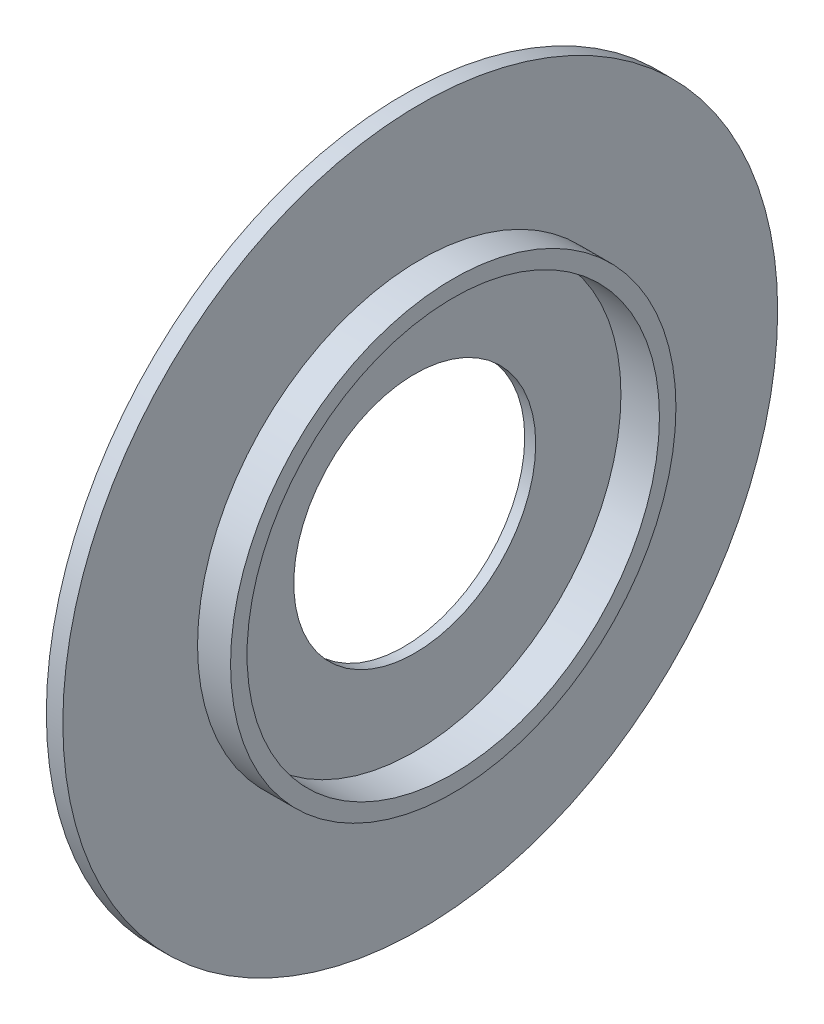
ISO-10303-21;
HEADER;
FILE_DESCRIPTION(('STEP AP214'),'2;1');
FILE_NAME('part.step','',(''),(''),'','','');
FILE_SCHEMA(('AUTOMOTIVE_DESIGN { 1 0 10303 214 1 1 1 1 }'));
ENDSEC;
DATA;
#1=APPLICATION_CONTEXT('core data for automotive mechanical design processes');
#2=APPLICATION_PROTOCOL_DEFINITION('international standard','automotive_design',2000,#1);
#3=PRODUCT_CONTEXT('',#1,'mechanical');
#4=PRODUCT('Part','Part','',(#3));
#5=PRODUCT_RELATED_PRODUCT_CATEGORY('part','',(#4));
#6=PRODUCT_DEFINITION_FORMATION('','',#4);
#7=PRODUCT_DEFINITION_CONTEXT('part definition',#1,'design');
#8=PRODUCT_DEFINITION('design','',#6,#7);
#9=PRODUCT_DEFINITION_SHAPE('','',#8);
#10=(LENGTH_UNIT() NAMED_UNIT(*) SI_UNIT(.MILLI.,.METRE.));
#11=(NAMED_UNIT(*) PLANE_ANGLE_UNIT() SI_UNIT($,.RADIAN.));
#12=(NAMED_UNIT(*) SI_UNIT($,.STERADIAN.) SOLID_ANGLE_UNIT());
#13=UNCERTAINTY_MEASURE_WITH_UNIT(LENGTH_MEASURE(1.E-05),#10,'distance_accuracy_value','');
#14=(GEOMETRIC_REPRESENTATION_CONTEXT(3) GLOBAL_UNCERTAINTY_ASSIGNED_CONTEXT((#13)) GLOBAL_UNIT_ASSIGNED_CONTEXT((#10,
#11,#12)) REPRESENTATION_CONTEXT('',''));
#15=CARTESIAN_POINT('',(0.,0.,0.));
#16=DIRECTION('',(0.,0.,1.));
#17=DIRECTION('',(1.,0.,0.));
#18=AXIS2_PLACEMENT_3D('',#15,#16,#17);
#19=CARTESIAN_POINT('',(75.,-18.3727272727273,-50.));
#20=DIRECTION('',(-1.,0.,0.));
#21=DIRECTION('',(0.,0.,1.));
#22=AXIS2_PLACEMENT_3D('',#19,#20,#21);
#23=CYLINDRICAL_SURFACE('',#22,65.);
#24=CARTESIAN_POINT('',(75.,-18.3727272727273,-50.));
#25=DIRECTION('',(1.,0.,0.));
#26=DIRECTION('',(0.,0.,-1.));
#27=AXIS2_PLACEMENT_3D('',#24,#25,#26);
#28=CIRCLE('',#27,65.);
#29=CARTESIAN_POINT('',(75.,-18.3727272727273,-115.));
#30=VERTEX_POINT('',#29);
#31=EDGE_CURVE('E10',#30,#30,#28,.T.);
#32=ORIENTED_EDGE('',*,*,#31,.F.);
#33=EDGE_LOOP('',(#32));
#34=FACE_BOUND('',#33,.T.);
#35=CARTESIAN_POINT('',(72.,-18.3727272727273,-50.));
#36=DIRECTION('',(1.,0.,0.));
#37=DIRECTION('',(0.,0.,-1.));
#38=AXIS2_PLACEMENT_3D('',#35,#36,#37);
#39=CIRCLE('',#38,65.);
#40=CARTESIAN_POINT('',(72.,-18.3727272727273,-115.));
#41=VERTEX_POINT('',#40);
#42=EDGE_CURVE('E34',#41,#41,#39,.T.);
#43=ORIENTED_EDGE('',*,*,#42,.T.);
#44=EDGE_LOOP('',(#43));
#45=FACE_BOUND('',#44,.T.);
#46=ADVANCED_FACE('F31',(#34,#45),#23,.T.);
#47=CARTESIAN_POINT('',(75.,-18.3727272727273,-50.));
#48=DIRECTION('',(1.,0.,0.));
#49=DIRECTION('',(0.,0.,-1.));
#50=AXIS2_PLACEMENT_3D('',#47,#48,#49);
#51=PLANE('',#50);
#52=CARTESIAN_POINT('',(75.,-18.3727272727273,-50.));
#53=DIRECTION('',(1.,0.,0.));
#54=DIRECTION('',(0.,0.,-1.));
#55=AXIS2_PLACEMENT_3D('',#52,#53,#54);
#56=CIRCLE('',#55,40.5);
#57=CARTESIAN_POINT('',(75.,-18.3727272727273,-90.5));
#58=VERTEX_POINT('',#57);
#59=EDGE_CURVE('E43',#58,#58,#56,.T.);
#60=ORIENTED_EDGE('',*,*,#59,.F.);
#61=EDGE_LOOP('',(#60));
#62=FACE_BOUND('',#61,.T.);
#63=ORIENTED_EDGE('',*,*,#31,.T.);
#64=EDGE_LOOP('',(#63));
#65=FACE_BOUND('',#64,.T.);
#66=ADVANCED_FACE('F89',(#62,#65),#51,.T.);
#67=CARTESIAN_POINT('',(72.,-18.3727272727273,-50.));
#68=DIRECTION('',(1.,0.,0.));
#69=DIRECTION('',(0.,0.,-1.));
#70=AXIS2_PLACEMENT_3D('',#67,#68,#69);
#71=PLANE('',#70);
#72=CARTESIAN_POINT('',(72.,-18.3727272727273,-50.));
#73=DIRECTION('',(1.,0.,0.));
#74=DIRECTION('',(0.,0.,-1.));
#75=AXIS2_PLACEMENT_3D('',#72,#73,#74);
#76=CIRCLE('',#75,22.);
#77=CARTESIAN_POINT('',(72.,-18.3727272727273,-72.));
#78=VERTEX_POINT('',#77);
#79=EDGE_CURVE('E54',#78,#78,#76,.T.);
#80=ORIENTED_EDGE('',*,*,#79,.T.);
#81=EDGE_LOOP('',(#80));
#82=FACE_BOUND('',#81,.T.);
#83=ORIENTED_EDGE('',*,*,#42,.F.);
#84=EDGE_LOOP('',(#83));
#85=FACE_BOUND('',#84,.T.);
#86=ADVANCED_FACE('F61',(#82,#85),#71,.F.);
#87=CARTESIAN_POINT('',(81.,-18.3727272727273,-50.));
#88=DIRECTION('',(1.,0.,0.));
#89=DIRECTION('',(0.,0.,-1.));
#90=AXIS2_PLACEMENT_3D('',#87,#88,#89);
#91=PLANE('',#90);
#92=CARTESIAN_POINT('',(81.,-18.3727272727273,-50.));
#93=DIRECTION('',(1.,0.,0.));
#94=DIRECTION('',(0.,0.,-1.));
#95=AXIS2_PLACEMENT_3D('',#92,#93,#94);
#96=CIRCLE('',#95,40.5);
#97=CARTESIAN_POINT('',(81.,-18.3727272727273,-90.5));
#98=VERTEX_POINT('',#97);
#99=EDGE_CURVE('E41',#98,#98,#96,.T.);
#100=ORIENTED_EDGE('',*,*,#99,.T.);
#101=EDGE_LOOP('',(#100));
#102=FACE_BOUND('',#101,.T.);
#103=CARTESIAN_POINT('',(81.,-18.3727272727273,-50.));
#104=DIRECTION('',(1.,0.,0.));
#105=DIRECTION('',(0.,0.,-1.));
#106=AXIS2_PLACEMENT_3D('',#103,#104,#105);
#107=CIRCLE('',#106,37.5);
#108=CARTESIAN_POINT('',(81.,-18.3727272727273,-87.5));
#109=VERTEX_POINT('',#108);
#110=EDGE_CURVE('E46',#109,#109,#107,.T.);
#111=ORIENTED_EDGE('',*,*,#110,.F.);
#112=EDGE_LOOP('',(#111));
#113=FACE_BOUND('',#112,.T.);
#114=ADVANCED_FACE('F84',(#102,#113),#91,.T.);
#115=CARTESIAN_POINT('',(81.,-18.3727272727273,-50.));
#116=DIRECTION('',(-1.,0.,0.));
#117=DIRECTION('',(0.,0.,1.));
#118=AXIS2_PLACEMENT_3D('',#115,#116,#117);
#119=CYLINDRICAL_SURFACE('',#118,40.5);
#120=ORIENTED_EDGE('',*,*,#99,.F.);
#121=EDGE_LOOP('',(#120));
#122=FACE_BOUND('',#121,.T.);
#123=ORIENTED_EDGE('',*,*,#59,.T.);
#124=EDGE_LOOP('',(#123));
#125=FACE_BOUND('',#124,.T.);
#126=ADVANCED_FACE('F78',(#122,#125),#119,.T.);
#127=CARTESIAN_POINT('',(81.,-18.3727272727273,-50.));
#128=DIRECTION('',(-1.,0.,0.));
#129=DIRECTION('',(0.,0.,1.));
#130=AXIS2_PLACEMENT_3D('',#127,#128,#129);
#131=CYLINDRICAL_SURFACE('',#130,37.5);
#132=ORIENTED_EDGE('',*,*,#110,.T.);
#133=EDGE_LOOP('',(#132));
#134=FACE_BOUND('',#133,.T.);
#135=CARTESIAN_POINT('',(74.,-18.3727272727273,-50.));
#136=DIRECTION('',(1.,0.,0.));
#137=DIRECTION('',(0.,0.,-1.));
#138=AXIS2_PLACEMENT_3D('',#135,#136,#137);
#139=CIRCLE('',#138,37.5);
#140=CARTESIAN_POINT('',(74.,-18.3727272727273,-87.5));
#141=VERTEX_POINT('',#140);
#142=EDGE_CURVE('E51',#141,#141,#139,.T.);
#143=ORIENTED_EDGE('',*,*,#142,.F.);
#144=EDGE_LOOP('',(#143));
#145=FACE_BOUND('',#144,.T.);
#146=ADVANCED_FACE('F73',(#134,#145),#131,.F.);
#147=CARTESIAN_POINT('',(74.,-18.3727272727273,-50.));
#148=DIRECTION('',(1.,0.,0.));
#149=DIRECTION('',(0.,0.,-1.));
#150=AXIS2_PLACEMENT_3D('',#147,#148,#149);
#151=PLANE('',#150);
#152=CARTESIAN_POINT('',(74.,-18.3727272727273,-50.));
#153=DIRECTION('',(1.,0.,0.));
#154=DIRECTION('',(0.,0.,-1.));
#155=AXIS2_PLACEMENT_3D('',#152,#153,#154);
#156=CIRCLE('',#155,22.);
#157=CARTESIAN_POINT('',(74.,-18.3727272727273,-72.));
#158=VERTEX_POINT('',#157);
#159=EDGE_CURVE('E55',#158,#158,#156,.T.);
#160=ORIENTED_EDGE('',*,*,#159,.F.);
#161=EDGE_LOOP('',(#160));
#162=FACE_BOUND('',#161,.T.);
#163=ORIENTED_EDGE('',*,*,#142,.T.);
#164=EDGE_LOOP('',(#163));
#165=FACE_BOUND('',#164,.T.);
#166=ADVANCED_FACE('F67',(#162,#165),#151,.T.);
#167=CARTESIAN_POINT('',(72.,-18.3727272727273,-50.));
#168=DIRECTION('',(1.,0.,0.));
#169=DIRECTION('',(0.,0.,-1.));
#170=AXIS2_PLACEMENT_3D('',#167,#168,#169);
#171=CYLINDRICAL_SURFACE('',#170,22.);
#172=ORIENTED_EDGE('',*,*,#79,.F.);
#173=EDGE_LOOP('',(#172));
#174=FACE_BOUND('',#173,.T.);
#175=ORIENTED_EDGE('',*,*,#159,.T.);
#176=EDGE_LOOP('',(#175));
#177=FACE_BOUND('',#176,.T.);
#178=ADVANCED_FACE('F64',(#174,#177),#171,.F.);
#179=CLOSED_SHELL('',(#46,#66,#86,#114,#126,#146,#166,#178));
#180=MANIFOLD_SOLID_BREP('B2',#179);
#181=ADVANCED_BREP_SHAPE_REPRESENTATION('',(#18,#180),#14);
#182=SHAPE_DEFINITION_REPRESENTATION(#9,#181);
ENDSEC;
END-ISO-10303-21;
